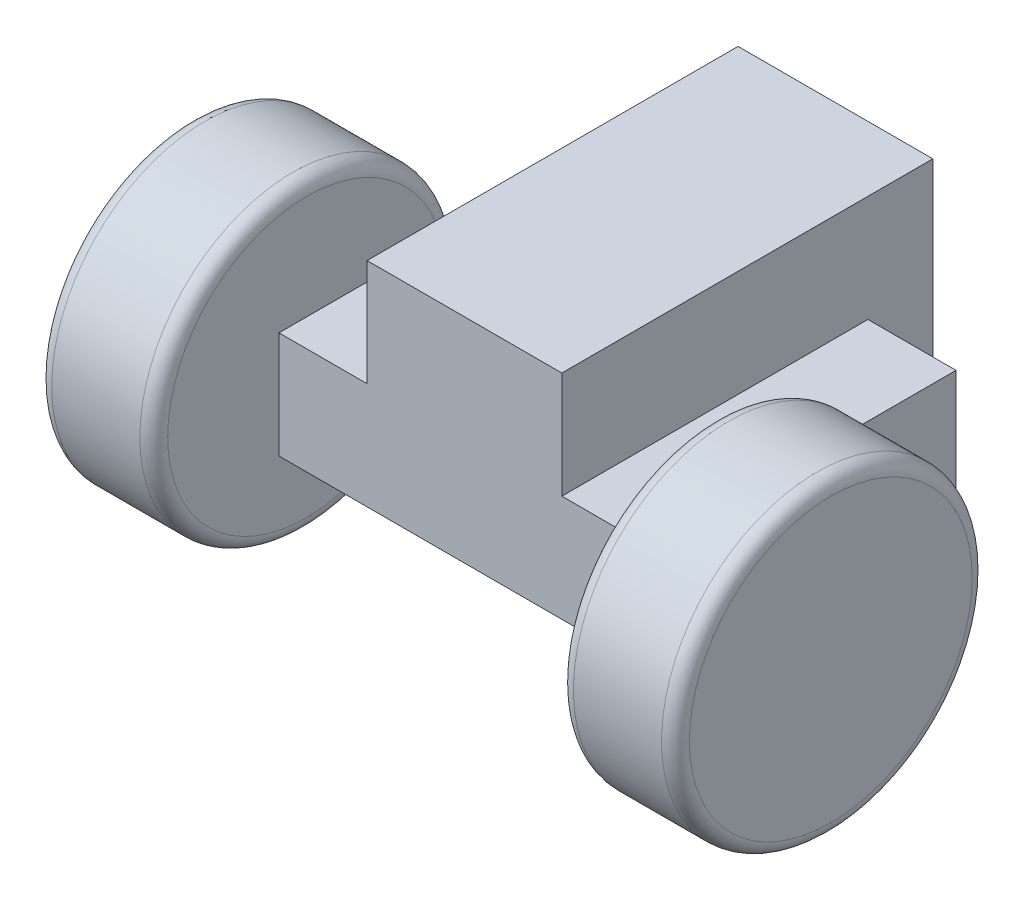
ISO-10303-21;
HEADER;
FILE_DESCRIPTION(('STEP AP214'),'2;1');
FILE_NAME('part.step','',(''),(''),'','','');
FILE_SCHEMA(('AUTOMOTIVE_DESIGN { 1 0 10303 214 1 1 1 1 }'));
ENDSEC;
DATA;
#1=APPLICATION_CONTEXT('core data for automotive mechanical design processes');
#2=APPLICATION_PROTOCOL_DEFINITION('international standard','automotive_design',2000,#1);
#3=PRODUCT_CONTEXT('',#1,'mechanical');
#4=PRODUCT('Part','Part','',(#3));
#5=PRODUCT_RELATED_PRODUCT_CATEGORY('part','',(#4));
#6=PRODUCT_DEFINITION_FORMATION('','',#4);
#7=PRODUCT_DEFINITION_CONTEXT('part definition',#1,'design');
#8=PRODUCT_DEFINITION('design','',#6,#7);
#9=PRODUCT_DEFINITION_SHAPE('','',#8);
#10=(LENGTH_UNIT() NAMED_UNIT(*) SI_UNIT(.MILLI.,.METRE.));
#11=(NAMED_UNIT(*) PLANE_ANGLE_UNIT() SI_UNIT($,.RADIAN.));
#12=(NAMED_UNIT(*) SI_UNIT($,.STERADIAN.) SOLID_ANGLE_UNIT());
#13=UNCERTAINTY_MEASURE_WITH_UNIT(LENGTH_MEASURE(1.E-05),#10,'distance_accuracy_value','');
#14=(GEOMETRIC_REPRESENTATION_CONTEXT(3) GLOBAL_UNCERTAINTY_ASSIGNED_CONTEXT((#13)) GLOBAL_UNIT_ASSIGNED_CONTEXT((#10,
#11,#12)) REPRESENTATION_CONTEXT('',''));
#15=CARTESIAN_POINT('',(0.,0.,0.));
#16=DIRECTION('',(0.,0.,1.));
#17=DIRECTION('',(1.,0.,0.));
#18=AXIS2_PLACEMENT_3D('',#15,#16,#17);
#19=CARTESIAN_POINT('',(34.969696969697,46.,-40.1515151515152));
#20=DIRECTION('',(1.,0.,0.));
#21=DIRECTION('',(0.,0.,-1.));
#22=AXIS2_PLACEMENT_3D('',#19,#20,#21);
#23=PLANE('',#22);
#24=DIRECTION('',(0.,-1.,0.));
#25=VECTOR('',#24,1.);
#26=CARTESIAN_POINT('',(34.969696969697,0.,-26.1515151515152));
#27=LINE('',#26,#25);
#28=CARTESIAN_POINT('',(34.969696969697,23.,-26.1515151515152));
#29=VERTEX_POINT('',#28);
#30=CARTESIAN_POINT('',(34.969696969697,0.,-26.1515151515152));
#31=VERTEX_POINT('',#30);
#32=EDGE_CURVE('E127',#29,#31,#27,.T.);
#33=ORIENTED_EDGE('',*,*,#32,.F.);
#34=DIRECTION('',(0.,0.,-1.));
#35=VECTOR('',#34,1.);
#36=CARTESIAN_POINT('',(34.969696969697,23.,39.8484848484848));
#37=LINE('',#36,#35);
#38=CARTESIAN_POINT('',(34.969696969697,23.,39.8484848484848));
#39=VERTEX_POINT('',#38);
#40=EDGE_CURVE('E47',#39,#29,#37,.T.);
#41=ORIENTED_EDGE('',*,*,#40,.F.);
#42=DIRECTION('',(0.,-1.,0.));
#43=VECTOR('',#42,1.);
#44=CARTESIAN_POINT('',(34.969696969697,46.,39.8484848484848));
#45=LINE('',#44,#43);
#46=CARTESIAN_POINT('',(34.969696969697,46.,39.8484848484848));
#47=VERTEX_POINT('',#46);
#48=EDGE_CURVE('E130',#47,#39,#45,.T.);
#49=ORIENTED_EDGE('',*,*,#48,.F.);
#50=DIRECTION('',(0.,0.,1.));
#51=VECTOR('',#50,1.);
#52=CARTESIAN_POINT('',(34.969696969697,46.,-40.1515151515152));
#53=LINE('',#52,#51);
#54=CARTESIAN_POINT('',(34.969696969697,46.,-40.1515151515152));
#55=VERTEX_POINT('',#54);
#56=EDGE_CURVE('E163',#55,#47,#53,.T.);
#57=ORIENTED_EDGE('',*,*,#56,.F.);
#58=DIRECTION('',(0.,-1.,0.));
#59=VECTOR('',#58,1.);
#60=CARTESIAN_POINT('',(34.969696969697,46.,-40.1515151515152));
#61=LINE('',#60,#59);
#62=CARTESIAN_POINT('',(34.969696969697,0.,-40.1515151515152));
#63=VERTEX_POINT('',#62);
#64=EDGE_CURVE('E175',#55,#63,#61,.T.);
#65=ORIENTED_EDGE('',*,*,#64,.T.);
#66=DIRECTION('',(0.,0.,1.));
#67=VECTOR('',#66,1.);
#68=CARTESIAN_POINT('',(34.969696969697,0.,-40.1515151515152));
#69=LINE('',#68,#67);
#70=EDGE_CURVE('E53',#63,#31,#69,.T.);
#71=ORIENTED_EDGE('',*,*,#70,.T.);
#72=EDGE_LOOP('',(#33,#41,#49,#57,#65,#71));
#73=FACE_BOUND('',#72,.T.);
#74=ADVANCED_FACE('F32',(#73),#23,.F.);
#75=CARTESIAN_POINT('',(34.969696969697,46.,39.8484848484848));
#76=DIRECTION('',(0.,0.,-1.));
#77=DIRECTION('',(-1.,0.,0.));
#78=AXIS2_PLACEMENT_3D('',#75,#76,#77);
#79=PLANE('',#78);
#80=DIRECTION('',(1.,0.,0.));
#81=VECTOR('',#80,1.);
#82=CARTESIAN_POINT('',(34.969696969697,0.,39.8484848484848));
#83=LINE('',#82,#81);
#84=CARTESIAN_POINT('',(15.969696969697,0.,39.8484848484848));
#85=VERTEX_POINT('',#84);
#86=CARTESIAN_POINT('',(95.969696969697,0.,39.8484848484848));
#87=VERTEX_POINT('',#86);
#88=EDGE_CURVE('E177',#85,#87,#83,.T.);
#89=ORIENTED_EDGE('',*,*,#88,.T.);
#90=DIRECTION('',(0.,-1.,0.));
#91=VECTOR('',#90,1.);
#92=CARTESIAN_POINT('',(95.969696969697,0.,39.8484848484848));
#93=LINE('',#92,#91);
#94=CARTESIAN_POINT('',(95.969696969697,23.,39.8484848484848));
#95=VERTEX_POINT('',#94);
#96=EDGE_CURVE('E140',#95,#87,#93,.T.);
#97=ORIENTED_EDGE('',*,*,#96,.F.);
#98=DIRECTION('',(-1.,0.,0.));
#99=VECTOR('',#98,1.);
#100=CARTESIAN_POINT('',(95.969696969697,23.,39.8484848484848));
#101=LINE('',#100,#99);
#102=CARTESIAN_POINT('',(76.969696969697,23.,39.8484848484848));
#103=VERTEX_POINT('',#102);
#104=EDGE_CURVE('E150',#95,#103,#101,.T.);
#105=ORIENTED_EDGE('',*,*,#104,.T.);
#106=DIRECTION('',(0.,-1.,0.));
#107=VECTOR('',#106,1.);
#108=CARTESIAN_POINT('',(76.969696969697,46.,39.8484848484848));
#109=LINE('',#108,#107);
#110=CARTESIAN_POINT('',(76.969696969697,46.,39.8484848484848));
#111=VERTEX_POINT('',#110);
#112=EDGE_CURVE('E187',#111,#103,#109,.T.);
#113=ORIENTED_EDGE('',*,*,#112,.F.);
#114=DIRECTION('',(1.,0.,0.));
#115=VECTOR('',#114,1.);
#116=CARTESIAN_POINT('',(34.969696969697,46.,39.8484848484848));
#117=LINE('',#116,#115);
#118=EDGE_CURVE('E166',#47,#111,#117,.T.);
#119=ORIENTED_EDGE('',*,*,#118,.F.);
#120=ORIENTED_EDGE('',*,*,#48,.T.);
#121=DIRECTION('',(1.,0.,0.));
#122=VECTOR('',#121,1.);
#123=CARTESIAN_POINT('',(15.969696969697,23.,39.8484848484848));
#124=LINE('',#123,#122);
#125=CARTESIAN_POINT('',(15.969696969697,23.,39.8484848484848));
#126=VERTEX_POINT('',#125);
#127=EDGE_CURVE('E113',#126,#39,#124,.T.);
#128=ORIENTED_EDGE('',*,*,#127,.F.);
#129=DIRECTION('',(0.,1.,0.));
#130=VECTOR('',#129,1.);
#131=CARTESIAN_POINT('',(15.969696969697,0.,39.8484848484848));
#132=LINE('',#131,#130);
#133=EDGE_CURVE('E119',#85,#126,#132,.T.);
#134=ORIENTED_EDGE('',*,*,#133,.F.);
#135=EDGE_LOOP('',(#89,#97,#105,#113,#119,#120,#128,#134));
#136=FACE_BOUND('',#135,.T.);
#137=ADVANCED_FACE('F129',(#136),#79,.F.);
#138=CARTESIAN_POINT('',(76.969696969697,46.,-40.1515151515152));
#139=DIRECTION('',(1.,0.,0.));
#140=DIRECTION('',(0.,0.,-1.));
#141=AXIS2_PLACEMENT_3D('',#138,#139,#140);
#142=PLANE('',#141);
#143=DIRECTION('',(0.,0.,1.));
#144=VECTOR('',#143,1.);
#145=CARTESIAN_POINT('',(76.969696969697,23.,39.8484848484848));
#146=LINE('',#145,#144);
#147=CARTESIAN_POINT('',(76.969696969697,23.,-26.1515151515152));
#148=VERTEX_POINT('',#147);
#149=EDGE_CURVE('E144',#148,#103,#146,.T.);
#150=ORIENTED_EDGE('',*,*,#149,.F.);
#151=DIRECTION('',(0.,1.,0.));
#152=VECTOR('',#151,1.);
#153=CARTESIAN_POINT('',(76.969696969697,0.,-26.1515151515152));
#154=LINE('',#153,#152);
#155=CARTESIAN_POINT('',(76.969696969697,0.,-26.1515151515152));
#156=VERTEX_POINT('',#155);
#157=EDGE_CURVE('E134',#156,#148,#154,.T.);
#158=ORIENTED_EDGE('',*,*,#157,.F.);
#159=DIRECTION('',(0.,0.,1.));
#160=VECTOR('',#159,1.);
#161=CARTESIAN_POINT('',(76.969696969697,0.,-40.1515151515152));
#162=LINE('',#161,#160);
#163=CARTESIAN_POINT('',(76.969696969697,0.,-40.1515151515152));
#164=VERTEX_POINT('',#163);
#165=EDGE_CURVE('E179',#164,#156,#162,.T.);
#166=ORIENTED_EDGE('',*,*,#165,.F.);
#167=DIRECTION('',(0.,-1.,0.));
#168=VECTOR('',#167,1.);
#169=CARTESIAN_POINT('',(76.969696969697,46.,-40.1515151515152));
#170=LINE('',#169,#168);
#171=CARTESIAN_POINT('',(76.969696969697,46.,-40.1515151515152));
#172=VERTEX_POINT('',#171);
#173=EDGE_CURVE('E185',#172,#164,#170,.T.);
#174=ORIENTED_EDGE('',*,*,#173,.F.);
#175=DIRECTION('',(0.,0.,1.));
#176=VECTOR('',#175,1.);
#177=CARTESIAN_POINT('',(76.969696969697,46.,-40.1515151515152));
#178=LINE('',#177,#176);
#179=EDGE_CURVE('E169',#172,#111,#178,.T.);
#180=ORIENTED_EDGE('',*,*,#179,.T.);
#181=ORIENTED_EDGE('',*,*,#112,.T.);
#182=EDGE_LOOP('',(#150,#158,#166,#174,#180,#181));
#183=FACE_BOUND('',#182,.T.);
#184=ADVANCED_FACE('F246',(#183),#142,.T.);
#185=CARTESIAN_POINT('',(34.969696969697,46.,-40.1515151515152));
#186=DIRECTION('',(0.,0.,-1.));
#187=DIRECTION('',(-1.,0.,0.));
#188=AXIS2_PLACEMENT_3D('',#185,#186,#187);
#189=PLANE('',#188);
#190=DIRECTION('',(1.,0.,0.));
#191=VECTOR('',#190,1.);
#192=CARTESIAN_POINT('',(34.969696969697,0.,-40.1515151515152));
#193=LINE('',#192,#191);
#194=EDGE_CURVE('E167',#63,#164,#193,.T.);
#195=ORIENTED_EDGE('',*,*,#194,.F.);
#196=ORIENTED_EDGE('',*,*,#64,.F.);
#197=DIRECTION('',(1.,0.,0.));
#198=VECTOR('',#197,1.);
#199=CARTESIAN_POINT('',(34.969696969697,46.,-40.1515151515152));
#200=LINE('',#199,#198);
#201=EDGE_CURVE('E172',#55,#172,#200,.T.);
#202=ORIENTED_EDGE('',*,*,#201,.T.);
#203=ORIENTED_EDGE('',*,*,#173,.T.);
#204=EDGE_LOOP('',(#195,#196,#202,#203));
#205=FACE_BOUND('',#204,.T.);
#206=ADVANCED_FACE('F294',(#205),#189,.T.);
#207=CARTESIAN_POINT('',(0.,46.,0.));
#208=DIRECTION('',(0.,1.,0.));
#209=DIRECTION('',(0.,0.,1.));
#210=AXIS2_PLACEMENT_3D('',#207,#208,#209);
#211=PLANE('',#210);
#212=ORIENTED_EDGE('',*,*,#56,.T.);
#213=ORIENTED_EDGE('',*,*,#118,.T.);
#214=ORIENTED_EDGE('',*,*,#179,.F.);
#215=ORIENTED_EDGE('',*,*,#201,.F.);
#216=EDGE_LOOP('',(#212,#213,#214,#215));
#217=FACE_BOUND('',#216,.T.);
#218=ADVANCED_FACE('F291',(#217),#211,.T.);
#219=CARTESIAN_POINT('',(0.,0.,0.));
#220=DIRECTION('',(0.,1.,0.));
#221=DIRECTION('',(0.,0.,1.));
#222=AXIS2_PLACEMENT_3D('',#219,#220,#221);
#223=PLANE('',#222);
#224=ORIENTED_EDGE('',*,*,#70,.F.);
#225=ORIENTED_EDGE('',*,*,#194,.T.);
#226=ORIENTED_EDGE('',*,*,#165,.T.);
#227=DIRECTION('',(-1.,0.,0.));
#228=VECTOR('',#227,1.);
#229=CARTESIAN_POINT('',(95.969696969697,0.,-26.1515151515152));
#230=LINE('',#229,#228);
#231=CARTESIAN_POINT('',(95.969696969697,0.,-26.1515151515152));
#232=VERTEX_POINT('',#231);
#233=EDGE_CURVE('E160',#232,#156,#230,.T.);
#234=ORIENTED_EDGE('',*,*,#233,.F.);
#235=DIRECTION('',(0.,0.,-1.));
#236=VECTOR('',#235,1.);
#237=CARTESIAN_POINT('',(95.969696969697,0.,39.8484848484848));
#238=LINE('',#237,#236);
#239=EDGE_CURVE('E143',#87,#232,#238,.T.);
#240=ORIENTED_EDGE('',*,*,#239,.F.);
#241=ORIENTED_EDGE('',*,*,#88,.F.);
#242=DIRECTION('',(0.,0.,1.));
#243=VECTOR('',#242,1.);
#244=CARTESIAN_POINT('',(15.969696969697,0.,39.8484848484848));
#245=LINE('',#244,#243);
#246=CARTESIAN_POINT('',(15.969696969697,0.,-26.1515151515152));
#247=VERTEX_POINT('',#246);
#248=EDGE_CURVE('E125',#247,#85,#245,.T.);
#249=ORIENTED_EDGE('',*,*,#248,.F.);
#250=DIRECTION('',(1.,0.,0.));
#251=VECTOR('',#250,1.);
#252=CARTESIAN_POINT('',(15.969696969697,0.,-26.1515151515152));
#253=LINE('',#252,#251);
#254=EDGE_CURVE('E136',#247,#31,#253,.T.);
#255=ORIENTED_EDGE('',*,*,#254,.T.);
#256=EDGE_LOOP('',(#224,#225,#226,#234,#240,#241,#249,#255));
#257=FACE_BOUND('',#256,.T.);
#258=ADVANCED_FACE('F289',(#257),#223,.F.);
#259=CARTESIAN_POINT('',(95.969696969697,0.,-26.1515151515152));
#260=DIRECTION('',(0.,0.,1.));
#261=DIRECTION('',(1.,0.,0.));
#262=AXIS2_PLACEMENT_3D('',#259,#260,#261);
#263=PLANE('',#262);
#264=ORIENTED_EDGE('',*,*,#157,.T.);
#265=DIRECTION('',(-1.,0.,0.));
#266=VECTOR('',#265,1.);
#267=CARTESIAN_POINT('',(95.969696969697,23.,-26.1515151515152));
#268=LINE('',#267,#266);
#269=CARTESIAN_POINT('',(95.969696969697,23.,-26.1515151515152));
#270=VERTEX_POINT('',#269);
#271=EDGE_CURVE('E157',#270,#148,#268,.T.);
#272=ORIENTED_EDGE('',*,*,#271,.F.);
#273=DIRECTION('',(0.,1.,0.));
#274=VECTOR('',#273,1.);
#275=CARTESIAN_POINT('',(95.969696969697,0.,-26.1515151515152));
#276=LINE('',#275,#274);
#277=EDGE_CURVE('E146',#232,#270,#276,.T.);
#278=ORIENTED_EDGE('',*,*,#277,.F.);
#279=ORIENTED_EDGE('',*,*,#233,.T.);
#280=EDGE_LOOP('',(#264,#272,#278,#279));
#281=FACE_BOUND('',#280,.T.);
#282=ADVANCED_FACE('F285',(#281),#263,.F.);
#283=CARTESIAN_POINT('',(95.969696969697,23.,39.8484848484848));
#284=DIRECTION('',(0.,-1.,0.));
#285=DIRECTION('',(0.,0.,-1.));
#286=AXIS2_PLACEMENT_3D('',#283,#284,#285);
#287=PLANE('',#286);
#288=ORIENTED_EDGE('',*,*,#149,.T.);
#289=ORIENTED_EDGE('',*,*,#104,.F.);
#290=DIRECTION('',(0.,0.,1.));
#291=VECTOR('',#290,1.);
#292=CARTESIAN_POINT('',(95.969696969697,23.,39.8484848484848));
#293=LINE('',#292,#291);
#294=EDGE_CURVE('E148',#270,#95,#293,.T.);
#295=ORIENTED_EDGE('',*,*,#294,.F.);
#296=ORIENTED_EDGE('',*,*,#271,.T.);
#297=EDGE_LOOP('',(#288,#289,#295,#296));
#298=FACE_BOUND('',#297,.T.);
#299=ADVANCED_FACE('F281',(#298),#287,.F.);
#300=CARTESIAN_POINT('',(95.969696969697,0.,0.));
#301=DIRECTION('',(-1.,0.,0.));
#302=DIRECTION('',(0.,0.,1.));
#303=AXIS2_PLACEMENT_3D('',#300,#301,#302);
#304=PLANE('',#303);
#305=CARTESIAN_POINT('',(95.969696969697,11.5,29.8484848484848));
#306=DIRECTION('',(-1.,0.,0.));
#307=DIRECTION('',(0.,0.,1.));
#308=AXIS2_PLACEMENT_3D('',#305,#306,#307);
#309=CIRCLE('',#308,5.);
#310=CARTESIAN_POINT('',(95.969696969697,11.5,34.8484848484848));
#311=VERTEX_POINT('',#310);
#312=EDGE_CURVE('E190',#311,#311,#309,.F.);
#313=ORIENTED_EDGE('',*,*,#312,.F.);
#314=EDGE_LOOP('',(#313));
#315=FACE_BOUND('',#314,.T.);
#316=ORIENTED_EDGE('',*,*,#96,.T.);
#317=ORIENTED_EDGE('',*,*,#239,.T.);
#318=ORIENTED_EDGE('',*,*,#277,.T.);
#319=ORIENTED_EDGE('',*,*,#294,.T.);
#320=EDGE_LOOP('',(#316,#317,#318,#319));
#321=FACE_BOUND('',#320,.T.);
#322=ADVANCED_FACE('F274',(#315,#321),#304,.F.);
#323=CARTESIAN_POINT('',(99.969696969697,11.5,29.8484848484848));
#324=DIRECTION('',(-1.,0.,0.));
#325=DIRECTION('',(0.,0.,1.));
#326=AXIS2_PLACEMENT_3D('',#323,#324,#325);
#327=CYLINDRICAL_SURFACE('',#326,5.);
#328=CARTESIAN_POINT('',(99.969696969697,11.5,29.8484848484848));
#329=DIRECTION('',(1.,0.,0.));
#330=DIRECTION('',(0.,0.,-1.));
#331=AXIS2_PLACEMENT_3D('',#328,#329,#330);
#332=CIRCLE('',#331,5.);
#333=CARTESIAN_POINT('',(99.969696969697,11.5,24.8484848484848));
#334=VERTEX_POINT('',#333);
#335=EDGE_CURVE('E131',#334,#334,#332,.T.);
#336=ORIENTED_EDGE('',*,*,#335,.F.);
#337=EDGE_LOOP('',(#336));
#338=FACE_BOUND('',#337,.T.);
#339=ORIENTED_EDGE('',*,*,#312,.T.);
#340=EDGE_LOOP('',(#339));
#341=FACE_BOUND('',#340,.T.);
#342=ADVANCED_FACE('F264',(#338,#341),#327,.T.);
#343=CARTESIAN_POINT('',(124.969696969697,11.5,29.8484848484848));
#344=DIRECTION('',(-1.,0.,0.));
#345=DIRECTION('',(0.,0.,1.));
#346=AXIS2_PLACEMENT_3D('',#343,#344,#345);
#347=CYLINDRICAL_SURFACE('',#346,33.5);
#348=CARTESIAN_POINT('',(121.969696969697,11.5,29.8484848484848));
#349=DIRECTION('',(1.,0.,0.));
#350=DIRECTION('',(0.,0.,-1.));
#351=AXIS2_PLACEMENT_3D('',#348,#349,#350);
#352=CIRCLE('',#351,33.5);
#353=CARTESIAN_POINT('',(121.969696969697,11.5,-3.65151515151518));
#354=VERTEX_POINT('',#353);
#355=EDGE_CURVE('E199',#354,#354,#352,.F.);
#356=ORIENTED_EDGE('',*,*,#355,.T.);
#357=EDGE_LOOP('',(#356));
#358=FACE_BOUND('',#357,.T.);
#359=CARTESIAN_POINT('',(102.969696969697,11.5,29.8484848484848));
#360=DIRECTION('',(1.,0.,0.));
#361=DIRECTION('',(0.,0.,-1.));
#362=AXIS2_PLACEMENT_3D('',#359,#360,#361);
#363=CIRCLE('',#362,33.5);
#364=CARTESIAN_POINT('',(102.969696969697,11.5,-3.65151515151518));
#365=VERTEX_POINT('',#364);
#366=EDGE_CURVE('E196',#365,#365,#363,.T.);
#367=ORIENTED_EDGE('',*,*,#366,.T.);
#368=EDGE_LOOP('',(#367));
#369=FACE_BOUND('',#368,.T.);
#370=ADVANCED_FACE('F261',(#358,#369),#347,.T.);
#371=CARTESIAN_POINT('',(124.969696969697,11.5,29.8484848484848));
#372=DIRECTION('',(1.,0.,0.));
#373=DIRECTION('',(0.,0.,-1.));
#374=AXIS2_PLACEMENT_3D('',#371,#372,#373);
#375=PLANE('',#374);
#376=CARTESIAN_POINT('',(124.969696969697,11.5,29.8484848484848));
#377=DIRECTION('',(1.,0.,0.));
#378=DIRECTION('',(0.,0.,-1.));
#379=AXIS2_PLACEMENT_3D('',#376,#377,#378);
#380=CIRCLE('',#379,30.5);
#381=CARTESIAN_POINT('',(124.969696969697,11.5,-0.651515151515177));
#382=VERTEX_POINT('',#381);
#383=EDGE_CURVE('E193',#382,#382,#380,.T.);
#384=ORIENTED_EDGE('',*,*,#383,.T.);
#385=EDGE_LOOP('',(#384));
#386=FACE_BOUND('',#385,.T.);
#387=ADVANCED_FACE('F263',(#386),#375,.T.);
#388=CARTESIAN_POINT('',(99.969696969697,11.5,29.8484848484848));
#389=DIRECTION('',(1.,0.,0.));
#390=DIRECTION('',(0.,0.,-1.));
#391=AXIS2_PLACEMENT_3D('',#388,#389,#390);
#392=PLANE('',#391);
#393=CARTESIAN_POINT('',(99.969696969697,11.5,29.8484848484848));
#394=DIRECTION('',(1.,0.,0.));
#395=DIRECTION('',(0.,0.,-1.));
#396=AXIS2_PLACEMENT_3D('',#393,#394,#395);
#397=CIRCLE('',#396,30.5);
#398=CARTESIAN_POINT('',(99.969696969697,11.5,-0.651515151515177));
#399=VERTEX_POINT('',#398);
#400=EDGE_CURVE('E202',#399,#399,#397,.F.);
#401=ORIENTED_EDGE('',*,*,#400,.T.);
#402=EDGE_LOOP('',(#401));
#403=FACE_BOUND('',#402,.T.);
#404=ORIENTED_EDGE('',*,*,#335,.T.);
#405=EDGE_LOOP('',(#404));
#406=FACE_BOUND('',#405,.T.);
#407=ADVANCED_FACE('F271',(#403,#406),#392,.F.);
#408=CARTESIAN_POINT('',(15.969696969697,23.,39.8484848484848));
#409=DIRECTION('',(0.,-1.,0.));
#410=DIRECTION('',(0.,0.,-1.));
#411=AXIS2_PLACEMENT_3D('',#408,#409,#410);
#412=PLANE('',#411);
#413=ORIENTED_EDGE('',*,*,#40,.T.);
#414=DIRECTION('',(1.,0.,0.));
#415=VECTOR('',#414,1.);
#416=CARTESIAN_POINT('',(15.969696969697,23.,-26.1515151515152));
#417=LINE('',#416,#415);
#418=CARTESIAN_POINT('',(15.969696969697,23.,-26.1515151515152));
#419=VERTEX_POINT('',#418);
#420=EDGE_CURVE('E115',#419,#29,#417,.T.);
#421=ORIENTED_EDGE('',*,*,#420,.F.);
#422=DIRECTION('',(0.,0.,-1.));
#423=VECTOR('',#422,1.);
#424=CARTESIAN_POINT('',(15.969696969697,23.,39.8484848484848));
#425=LINE('',#424,#423);
#426=EDGE_CURVE('E109',#126,#419,#425,.T.);
#427=ORIENTED_EDGE('',*,*,#426,.F.);
#428=ORIENTED_EDGE('',*,*,#127,.T.);
#429=EDGE_LOOP('',(#413,#421,#427,#428));
#430=FACE_BOUND('',#429,.T.);
#431=ADVANCED_FACE('F111',(#430),#412,.F.);
#432=CARTESIAN_POINT('',(15.969696969697,0.,-26.1515151515152));
#433=DIRECTION('',(0.,0.,1.));
#434=DIRECTION('',(1.,0.,0.));
#435=AXIS2_PLACEMENT_3D('',#432,#433,#434);
#436=PLANE('',#435);
#437=ORIENTED_EDGE('',*,*,#32,.T.);
#438=ORIENTED_EDGE('',*,*,#254,.F.);
#439=DIRECTION('',(0.,-1.,0.));
#440=VECTOR('',#439,1.);
#441=CARTESIAN_POINT('',(15.969696969697,0.,-26.1515151515152));
#442=LINE('',#441,#440);
#443=EDGE_CURVE('E118',#419,#247,#442,.T.);
#444=ORIENTED_EDGE('',*,*,#443,.F.);
#445=ORIENTED_EDGE('',*,*,#420,.T.);
#446=EDGE_LOOP('',(#437,#438,#444,#445));
#447=FACE_BOUND('',#446,.T.);
#448=ADVANCED_FACE('F340',(#447),#436,.F.);
#449=CARTESIAN_POINT('',(15.969696969697,0.,0.));
#450=DIRECTION('',(-1.,0.,0.));
#451=DIRECTION('',(0.,0.,1.));
#452=AXIS2_PLACEMENT_3D('',#449,#450,#451);
#453=PLANE('',#452);
#454=CARTESIAN_POINT('',(15.969696969697,11.5,29.8484848484848));
#455=DIRECTION('',(-1.,0.,0.));
#456=DIRECTION('',(0.,0.,1.));
#457=AXIS2_PLACEMENT_3D('',#454,#455,#456);
#458=CIRCLE('',#457,5.);
#459=CARTESIAN_POINT('',(15.969696969697,11.5,34.8484848484848));
#460=VERTEX_POINT('',#459);
#461=EDGE_CURVE('E328',#460,#460,#458,.T.);
#462=ORIENTED_EDGE('',*,*,#461,.F.);
#463=EDGE_LOOP('',(#462));
#464=FACE_BOUND('',#463,.T.);
#465=ORIENTED_EDGE('',*,*,#133,.T.);
#466=ORIENTED_EDGE('',*,*,#426,.T.);
#467=ORIENTED_EDGE('',*,*,#443,.T.);
#468=ORIENTED_EDGE('',*,*,#248,.T.);
#469=EDGE_LOOP('',(#465,#466,#467,#468));
#470=FACE_BOUND('',#469,.T.);
#471=ADVANCED_FACE('F123',(#464,#470),#453,.T.);
#472=CARTESIAN_POINT('',(11.969696969697,11.5,29.8484848484848));
#473=DIRECTION('',(1.,0.,0.));
#474=DIRECTION('',(0.,0.,-1.));
#475=AXIS2_PLACEMENT_3D('',#472,#473,#474);
#476=CYLINDRICAL_SURFACE('',#475,5.);
#477=CARTESIAN_POINT('',(11.969696969697,11.5,29.8484848484848));
#478=DIRECTION('',(-1.,0.,0.));
#479=DIRECTION('',(0.,0.,1.));
#480=AXIS2_PLACEMENT_3D('',#477,#478,#479);
#481=CIRCLE('',#480,5.);
#482=CARTESIAN_POINT('',(11.969696969697,11.5,34.8484848484848));
#483=VERTEX_POINT('',#482);
#484=EDGE_CURVE('E325',#483,#483,#481,.T.);
#485=ORIENTED_EDGE('',*,*,#484,.F.);
#486=EDGE_LOOP('',(#485));
#487=FACE_BOUND('',#486,.T.);
#488=ORIENTED_EDGE('',*,*,#461,.T.);
#489=EDGE_LOOP('',(#488));
#490=FACE_BOUND('',#489,.T.);
#491=ADVANCED_FACE('F226',(#487,#490),#476,.T.);
#492=CARTESIAN_POINT('',(-13.030303030303,11.5,29.8484848484848));
#493=DIRECTION('',(1.,0.,0.));
#494=DIRECTION('',(0.,0.,-1.));
#495=AXIS2_PLACEMENT_3D('',#492,#493,#494);
#496=CYLINDRICAL_SURFACE('',#495,33.);
#497=CARTESIAN_POINT('',(8.96969696969697,11.5,29.8484848484848));
#498=DIRECTION('',(-1.,0.,0.));
#499=DIRECTION('',(0.,0.,1.));
#500=AXIS2_PLACEMENT_3D('',#497,#498,#499);
#501=CIRCLE('',#500,33.);
#502=CARTESIAN_POINT('',(8.96969696969697,11.5,62.8484848484849));
#503=VERTEX_POINT('',#502);
#504=EDGE_CURVE('E208',#503,#503,#501,.T.);
#505=ORIENTED_EDGE('',*,*,#504,.T.);
#506=EDGE_LOOP('',(#505));
#507=FACE_BOUND('',#506,.T.);
#508=CARTESIAN_POINT('',(-10.030303030303,11.5,29.8484848484848));
#509=DIRECTION('',(-1.,0.,0.));
#510=DIRECTION('',(0.,0.,1.));
#511=AXIS2_PLACEMENT_3D('',#508,#509,#510);
#512=CIRCLE('',#511,33.);
#513=CARTESIAN_POINT('',(-10.030303030303,11.5,62.8484848484849));
#514=VERTEX_POINT('',#513);
#515=EDGE_CURVE('E205',#514,#514,#512,.F.);
#516=ORIENTED_EDGE('',*,*,#515,.T.);
#517=EDGE_LOOP('',(#516));
#518=FACE_BOUND('',#517,.T.);
#519=ADVANCED_FACE('F222',(#507,#518),#496,.T.);
#520=CARTESIAN_POINT('',(-13.030303030303,11.5,29.8484848484848));
#521=DIRECTION('',(-1.,0.,0.));
#522=DIRECTION('',(0.,0.,1.));
#523=AXIS2_PLACEMENT_3D('',#520,#521,#522);
#524=PLANE('',#523);
#525=CARTESIAN_POINT('',(-13.030303030303,11.5,29.8484848484848));
#526=DIRECTION('',(-1.,0.,0.));
#527=DIRECTION('',(0.,0.,1.));
#528=AXIS2_PLACEMENT_3D('',#525,#526,#527);
#529=CIRCLE('',#528,30.);
#530=CARTESIAN_POINT('',(-13.030303030303,11.5,59.8484848484848));
#531=VERTEX_POINT('',#530);
#532=EDGE_CURVE('E11',#531,#531,#529,.T.);
#533=ORIENTED_EDGE('',*,*,#532,.T.);
#534=EDGE_LOOP('',(#533));
#535=FACE_BOUND('',#534,.T.);
#536=ADVANCED_FACE('F225',(#535),#524,.T.);
#537=CARTESIAN_POINT('',(11.969696969697,11.5,29.8484848484848));
#538=DIRECTION('',(-1.,0.,0.));
#539=DIRECTION('',(0.,0.,1.));
#540=AXIS2_PLACEMENT_3D('',#537,#538,#539);
#541=PLANE('',#540);
#542=CARTESIAN_POINT('',(11.969696969697,11.5,29.8484848484848));
#543=DIRECTION('',(-1.,0.,0.));
#544=DIRECTION('',(0.,0.,1.));
#545=AXIS2_PLACEMENT_3D('',#542,#543,#544);
#546=CIRCLE('',#545,30.);
#547=CARTESIAN_POINT('',(11.969696969697,11.5,59.8484848484848));
#548=VERTEX_POINT('',#547);
#549=EDGE_CURVE('E40',#548,#548,#546,.F.);
#550=ORIENTED_EDGE('',*,*,#549,.T.);
#551=EDGE_LOOP('',(#550));
#552=FACE_BOUND('',#551,.T.);
#553=ORIENTED_EDGE('',*,*,#484,.T.);
#554=EDGE_LOOP('',(#553));
#555=FACE_BOUND('',#554,.T.);
#556=ADVANCED_FACE('F213',(#552,#555),#541,.F.);
#557=CARTESIAN_POINT('',(121.969696969697,11.5,29.8484848484848));
#558=DIRECTION('',(1.,0.,0.));
#559=DIRECTION('',(0.,0.,-1.));
#560=AXIS2_PLACEMENT_3D('',#557,#558,#559);
#561=TOROIDAL_SURFACE('',#560,30.5,3.);
#562=ORIENTED_EDGE('',*,*,#355,.F.);
#563=EDGE_LOOP('',(#562));
#564=FACE_BOUND('',#563,.T.);
#565=ORIENTED_EDGE('',*,*,#383,.F.);
#566=EDGE_LOOP('',(#565));
#567=FACE_BOUND('',#566,.T.);
#568=ADVANCED_FACE('F239',(#564,#567),#561,.T.);
#569=CARTESIAN_POINT('',(102.969696969697,11.5,29.8484848484848));
#570=DIRECTION('',(1.,0.,0.));
#571=DIRECTION('',(0.,0.,-1.));
#572=AXIS2_PLACEMENT_3D('',#569,#570,#571);
#573=TOROIDAL_SURFACE('',#572,30.5,3.);
#574=ORIENTED_EDGE('',*,*,#400,.F.);
#575=EDGE_LOOP('',(#574));
#576=FACE_BOUND('',#575,.T.);
#577=ORIENTED_EDGE('',*,*,#366,.F.);
#578=EDGE_LOOP('',(#577));
#579=FACE_BOUND('',#578,.T.);
#580=ADVANCED_FACE('F219',(#576,#579),#573,.T.);
#581=CARTESIAN_POINT('',(8.96969696969697,11.5,29.8484848484848));
#582=DIRECTION('',(-1.,0.,0.));
#583=DIRECTION('',(0.,0.,1.));
#584=AXIS2_PLACEMENT_3D('',#581,#582,#583);
#585=TOROIDAL_SURFACE('',#584,30.,3.);
#586=ORIENTED_EDGE('',*,*,#549,.F.);
#587=EDGE_LOOP('',(#586));
#588=FACE_BOUND('',#587,.T.);
#589=ORIENTED_EDGE('',*,*,#504,.F.);
#590=EDGE_LOOP('',(#589));
#591=FACE_BOUND('',#590,.T.);
#592=ADVANCED_FACE('F216',(#588,#591),#585,.T.);
#593=CARTESIAN_POINT('',(-10.030303030303,11.5,29.8484848484848));
#594=DIRECTION('',(-1.,0.,0.));
#595=DIRECTION('',(0.,0.,1.));
#596=AXIS2_PLACEMENT_3D('',#593,#594,#595);
#597=TOROIDAL_SURFACE('',#596,30.,3.);
#598=ORIENTED_EDGE('',*,*,#515,.F.);
#599=EDGE_LOOP('',(#598));
#600=FACE_BOUND('',#599,.T.);
#601=ORIENTED_EDGE('',*,*,#532,.F.);
#602=EDGE_LOOP('',(#601));
#603=FACE_BOUND('',#602,.T.);
#604=ADVANCED_FACE('F34',(#600,#603),#597,.T.);
#605=CLOSED_SHELL('',(#74,#137,#184,#206,#218,#258,#282,#299,#322,#342,#370,#387,#407,#431,#448,
#471,#491,#519,#536,#556,#568,#580,#592,#604));
#606=MANIFOLD_SOLID_BREP('B2',#605);
#607=ADVANCED_BREP_SHAPE_REPRESENTATION('',(#18,#606),#14);
#608=SHAPE_DEFINITION_REPRESENTATION(#9,#607);
ENDSEC;
END-ISO-10303-21;
